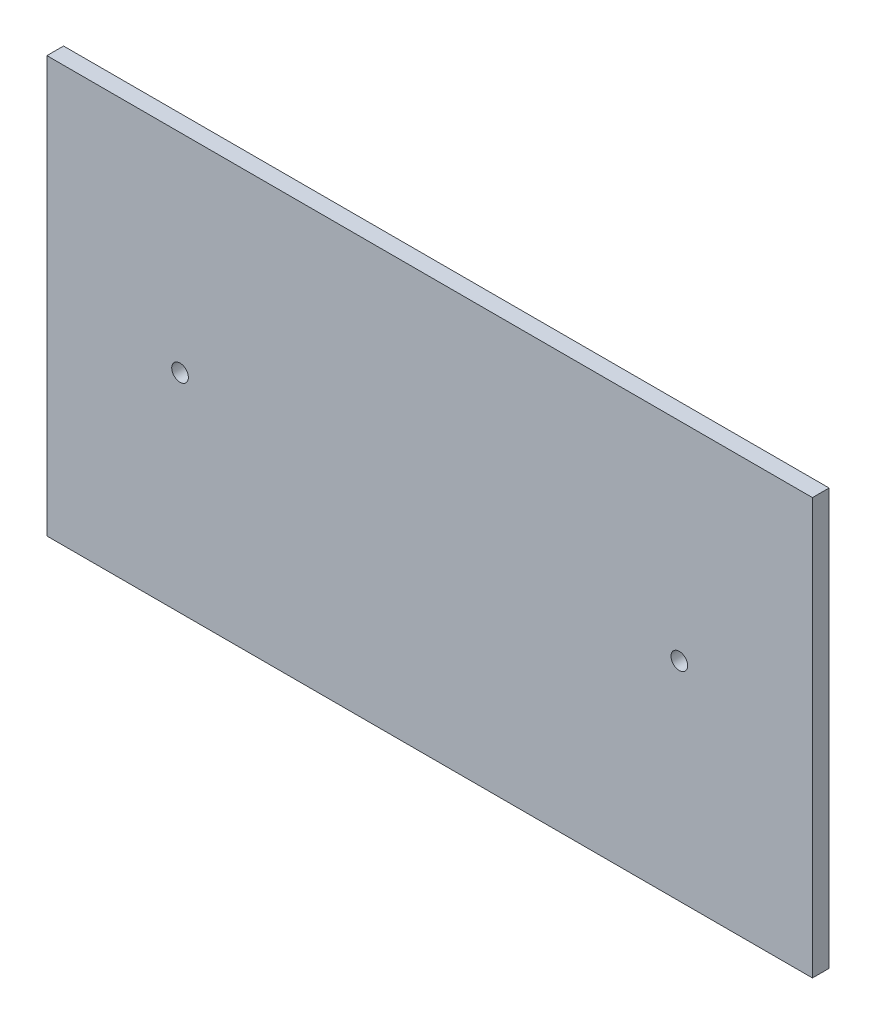
ISO-10303-21;
HEADER;
FILE_DESCRIPTION(('STEP AP214'),'2;1');
FILE_NAME('part.step','',(''),(''),'','','');
FILE_SCHEMA(('AUTOMOTIVE_DESIGN { 1 0 10303 214 1 1 1 1 }'));
ENDSEC;
DATA;
#1=APPLICATION_CONTEXT('core data for automotive mechanical design processes');
#2=APPLICATION_PROTOCOL_DEFINITION('international standard','automotive_design',2000,#1);
#3=PRODUCT_CONTEXT('',#1,'mechanical');
#4=PRODUCT('Part','Part','',(#3));
#5=PRODUCT_RELATED_PRODUCT_CATEGORY('part','',(#4));
#6=PRODUCT_DEFINITION_FORMATION('','',#4);
#7=PRODUCT_DEFINITION_CONTEXT('part definition',#1,'design');
#8=PRODUCT_DEFINITION('design','',#6,#7);
#9=PRODUCT_DEFINITION_SHAPE('','',#8);
#10=(LENGTH_UNIT() NAMED_UNIT(*) SI_UNIT(.MILLI.,.METRE.));
#11=(NAMED_UNIT(*) PLANE_ANGLE_UNIT() SI_UNIT($,.RADIAN.));
#12=(NAMED_UNIT(*) SI_UNIT($,.STERADIAN.) SOLID_ANGLE_UNIT());
#13=UNCERTAINTY_MEASURE_WITH_UNIT(LENGTH_MEASURE(1.E-05),#10,'distance_accuracy_value','');
#14=(GEOMETRIC_REPRESENTATION_CONTEXT(3) GLOBAL_UNCERTAINTY_ASSIGNED_CONTEXT((#13)) GLOBAL_UNIT_ASSIGNED_CONTEXT((#10,
#11,#12)) REPRESENTATION_CONTEXT('',''));
#15=CARTESIAN_POINT('',(0.,0.,0.));
#16=DIRECTION('',(0.,0.,1.));
#17=DIRECTION('',(1.,0.,0.));
#18=AXIS2_PLACEMENT_3D('',#15,#16,#17);
#19=CARTESIAN_POINT('',(0.,0.,10.));
#20=DIRECTION('',(0.,0.,1.));
#21=DIRECTION('',(1.,0.,0.));
#22=AXIS2_PLACEMENT_3D('',#19,#20,#21);
#23=PLANE('',#22);
#24=CARTESIAN_POINT('',(-150.,0.,10.));
#25=DIRECTION('',(0.,0.,1.));
#26=DIRECTION('',(1.,0.,0.));
#27=AXIS2_PLACEMENT_3D('',#24,#25,#26);
#28=CIRCLE('',#27,4.99999999999999);
#29=CARTESIAN_POINT('',(-145.,0.,10.));
#30=VERTEX_POINT('',#29);
#31=EDGE_CURVE('E99',#30,#30,#28,.T.);
#32=ORIENTED_EDGE('',*,*,#31,.F.);
#33=EDGE_LOOP('',(#32));
#34=FACE_BOUND('',#33,.T.);
#35=DIRECTION('',(0.,-1.,0.));
#36=VECTOR('',#35,1.);
#37=CARTESIAN_POINT('',(-230.,125.,10.));
#38=LINE('',#37,#36);
#39=CARTESIAN_POINT('',(-230.,125.,10.));
#40=VERTEX_POINT('',#39);
#41=CARTESIAN_POINT('',(-230.,-125.,10.));
#42=VERTEX_POINT('',#41);
#43=EDGE_CURVE('E84',#40,#42,#38,.T.);
#44=ORIENTED_EDGE('',*,*,#43,.T.);
#45=DIRECTION('',(1.,0.,0.));
#46=VECTOR('',#45,1.);
#47=CARTESIAN_POINT('',(-230.,-125.,10.));
#48=LINE('',#47,#46);
#49=CARTESIAN_POINT('',(230.,-125.,10.));
#50=VERTEX_POINT('',#49);
#51=EDGE_CURVE('E79',#42,#50,#48,.T.);
#52=ORIENTED_EDGE('',*,*,#51,.T.);
#53=DIRECTION('',(0.,1.,0.));
#54=VECTOR('',#53,1.);
#55=CARTESIAN_POINT('',(230.,125.,10.));
#56=LINE('',#55,#54);
#57=CARTESIAN_POINT('',(230.,125.,10.));
#58=VERTEX_POINT('',#57);
#59=EDGE_CURVE('E82',#50,#58,#56,.T.);
#60=ORIENTED_EDGE('',*,*,#59,.T.);
#61=DIRECTION('',(-1.,0.,0.));
#62=VECTOR('',#61,1.);
#63=CARTESIAN_POINT('',(-230.,125.,10.));
#64=LINE('',#63,#62);
#65=EDGE_CURVE('E49',#58,#40,#64,.T.);
#66=ORIENTED_EDGE('',*,*,#65,.T.);
#67=EDGE_LOOP('',(#44,#52,#60,#66));
#68=FACE_BOUND('',#67,.T.);
#69=CARTESIAN_POINT('',(150.,0.,10.));
#70=DIRECTION('',(0.,0.,1.));
#71=DIRECTION('',(1.,0.,0.));
#72=AXIS2_PLACEMENT_3D('',#69,#70,#71);
#73=CIRCLE('',#72,4.99999999999999);
#74=CARTESIAN_POINT('',(155.,0.,10.));
#75=VERTEX_POINT('',#74);
#76=EDGE_CURVE('E114',#75,#75,#73,.T.);
#77=ORIENTED_EDGE('',*,*,#76,.F.);
#78=EDGE_LOOP('',(#77));
#79=FACE_BOUND('',#78,.T.);
#80=ADVANCED_FACE('F32',(#34,#68,#79),#23,.T.);
#81=CARTESIAN_POINT('',(0.,0.,0.));
#82=DIRECTION('',(0.,0.,1.));
#83=DIRECTION('',(1.,0.,0.));
#84=AXIS2_PLACEMENT_3D('',#81,#82,#83);
#85=PLANE('',#84);
#86=DIRECTION('',(0.,-1.,0.));
#87=VECTOR('',#86,1.);
#88=CARTESIAN_POINT('',(-230.,125.,0.));
#89=LINE('',#88,#87);
#90=CARTESIAN_POINT('',(-230.,125.,0.));
#91=VERTEX_POINT('',#90);
#92=CARTESIAN_POINT('',(-230.,-125.,0.));
#93=VERTEX_POINT('',#92);
#94=EDGE_CURVE('E96',#91,#93,#89,.T.);
#95=ORIENTED_EDGE('',*,*,#94,.F.);
#96=DIRECTION('',(-1.,0.,0.));
#97=VECTOR('',#96,1.);
#98=CARTESIAN_POINT('',(-230.,125.,0.));
#99=LINE('',#98,#97);
#100=CARTESIAN_POINT('',(230.,125.,0.));
#101=VERTEX_POINT('',#100);
#102=EDGE_CURVE('E72',#101,#91,#99,.T.);
#103=ORIENTED_EDGE('',*,*,#102,.F.);
#104=DIRECTION('',(0.,1.,0.));
#105=VECTOR('',#104,1.);
#106=CARTESIAN_POINT('',(230.,125.,0.));
#107=LINE('',#106,#105);
#108=CARTESIAN_POINT('',(230.,-125.,0.));
#109=VERTEX_POINT('',#108);
#110=EDGE_CURVE('E66',#109,#101,#107,.T.);
#111=ORIENTED_EDGE('',*,*,#110,.F.);
#112=DIRECTION('',(1.,0.,0.));
#113=VECTOR('',#112,1.);
#114=CARTESIAN_POINT('',(-230.,-125.,0.));
#115=LINE('',#114,#113);
#116=EDGE_CURVE('E88',#93,#109,#115,.T.);
#117=ORIENTED_EDGE('',*,*,#116,.F.);
#118=EDGE_LOOP('',(#95,#103,#111,#117));
#119=FACE_BOUND('',#118,.T.);
#120=CARTESIAN_POINT('',(-150.,0.,0.));
#121=DIRECTION('',(0.,0.,1.));
#122=DIRECTION('',(1.,0.,0.));
#123=AXIS2_PLACEMENT_3D('',#120,#121,#122);
#124=CIRCLE('',#123,4.99999999999999);
#125=CARTESIAN_POINT('',(-145.,0.,0.));
#126=VERTEX_POINT('',#125);
#127=EDGE_CURVE('E111',#126,#126,#124,.T.);
#128=ORIENTED_EDGE('',*,*,#127,.T.);
#129=EDGE_LOOP('',(#128));
#130=FACE_BOUND('',#129,.T.);
#131=CARTESIAN_POINT('',(150.,0.,0.));
#132=DIRECTION('',(0.,0.,1.));
#133=DIRECTION('',(1.,0.,0.));
#134=AXIS2_PLACEMENT_3D('',#131,#132,#133);
#135=CIRCLE('',#134,4.99999999999999);
#136=CARTESIAN_POINT('',(155.,0.,0.));
#137=VERTEX_POINT('',#136);
#138=EDGE_CURVE('E117',#137,#137,#135,.T.);
#139=ORIENTED_EDGE('',*,*,#138,.T.);
#140=EDGE_LOOP('',(#139));
#141=FACE_BOUND('',#140,.T.);
#142=ADVANCED_FACE('F107',(#119,#130,#141),#85,.F.);
#143=CARTESIAN_POINT('',(-230.,125.,10.));
#144=DIRECTION('',(1.,0.,0.));
#145=DIRECTION('',(0.,0.,-1.));
#146=AXIS2_PLACEMENT_3D('',#143,#144,#145);
#147=PLANE('',#146);
#148=ORIENTED_EDGE('',*,*,#94,.T.);
#149=DIRECTION('',(0.,0.,-1.));
#150=VECTOR('',#149,1.);
#151=CARTESIAN_POINT('',(-230.,-125.,10.));
#152=LINE('',#151,#150);
#153=EDGE_CURVE('E11',#42,#93,#152,.T.);
#154=ORIENTED_EDGE('',*,*,#153,.F.);
#155=ORIENTED_EDGE('',*,*,#43,.F.);
#156=DIRECTION('',(0.,0.,-1.));
#157=VECTOR('',#156,1.);
#158=CARTESIAN_POINT('',(-230.,125.,10.));
#159=LINE('',#158,#157);
#160=EDGE_CURVE('E92',#40,#91,#159,.T.);
#161=ORIENTED_EDGE('',*,*,#160,.T.);
#162=EDGE_LOOP('',(#148,#154,#155,#161));
#163=FACE_BOUND('',#162,.T.);
#164=ADVANCED_FACE('F34',(#163),#147,.F.);
#165=CARTESIAN_POINT('',(-230.,-125.,10.));
#166=DIRECTION('',(0.,1.,0.));
#167=DIRECTION('',(0.,0.,1.));
#168=AXIS2_PLACEMENT_3D('',#165,#166,#167);
#169=PLANE('',#168);
#170=ORIENTED_EDGE('',*,*,#116,.T.);
#171=DIRECTION('',(0.,0.,-1.));
#172=VECTOR('',#171,1.);
#173=CARTESIAN_POINT('',(230.,-125.,10.));
#174=LINE('',#173,#172);
#175=EDGE_CURVE('E41',#50,#109,#174,.T.);
#176=ORIENTED_EDGE('',*,*,#175,.F.);
#177=ORIENTED_EDGE('',*,*,#51,.F.);
#178=ORIENTED_EDGE('',*,*,#153,.T.);
#179=EDGE_LOOP('',(#170,#176,#177,#178));
#180=FACE_BOUND('',#179,.T.);
#181=ADVANCED_FACE('F87',(#180),#169,.F.);
#182=CARTESIAN_POINT('',(230.,125.,10.));
#183=DIRECTION('',(-1.,0.,0.));
#184=DIRECTION('',(0.,0.,1.));
#185=AXIS2_PLACEMENT_3D('',#182,#183,#184);
#186=PLANE('',#185);
#187=ORIENTED_EDGE('',*,*,#110,.T.);
#188=DIRECTION('',(0.,0.,-1.));
#189=VECTOR('',#188,1.);
#190=CARTESIAN_POINT('',(230.,125.,10.));
#191=LINE('',#190,#189);
#192=EDGE_CURVE('E89',#58,#101,#191,.T.);
#193=ORIENTED_EDGE('',*,*,#192,.F.);
#194=ORIENTED_EDGE('',*,*,#59,.F.);
#195=ORIENTED_EDGE('',*,*,#175,.T.);
#196=EDGE_LOOP('',(#187,#193,#194,#195));
#197=FACE_BOUND('',#196,.T.);
#198=ADVANCED_FACE('F90',(#197),#186,.F.);
#199=CARTESIAN_POINT('',(-230.,125.,10.));
#200=DIRECTION('',(0.,-1.,0.));
#201=DIRECTION('',(1.,0.,0.));
#202=AXIS2_PLACEMENT_3D('',#199,#200,#201);
#203=PLANE('',#202);
#204=ORIENTED_EDGE('',*,*,#102,.T.);
#205=ORIENTED_EDGE('',*,*,#160,.F.);
#206=ORIENTED_EDGE('',*,*,#65,.F.);
#207=ORIENTED_EDGE('',*,*,#192,.T.);
#208=EDGE_LOOP('',(#204,#205,#206,#207));
#209=FACE_BOUND('',#208,.T.);
#210=ADVANCED_FACE('F104',(#209),#203,.F.);
#211=CARTESIAN_POINT('',(-150.,0.,10.));
#212=DIRECTION('',(0.,0.,-1.));
#213=DIRECTION('',(-1.,0.,0.));
#214=AXIS2_PLACEMENT_3D('',#211,#212,#213);
#215=CYLINDRICAL_SURFACE('',#214,4.99999999999999);
#216=ORIENTED_EDGE('',*,*,#31,.T.);
#217=EDGE_LOOP('',(#216));
#218=FACE_BOUND('',#217,.T.);
#219=ORIENTED_EDGE('',*,*,#127,.F.);
#220=EDGE_LOOP('',(#219));
#221=FACE_BOUND('',#220,.T.);
#222=ADVANCED_FACE('F134',(#218,#221),#215,.F.);
#223=CARTESIAN_POINT('',(150.,0.,10.));
#224=DIRECTION('',(0.,0.,-1.));
#225=DIRECTION('',(-1.,0.,0.));
#226=AXIS2_PLACEMENT_3D('',#223,#224,#225);
#227=CYLINDRICAL_SURFACE('',#226,4.99999999999999);
#228=ORIENTED_EDGE('',*,*,#76,.T.);
#229=EDGE_LOOP('',(#228));
#230=FACE_BOUND('',#229,.T.);
#231=ORIENTED_EDGE('',*,*,#138,.F.);
#232=EDGE_LOOP('',(#231));
#233=FACE_BOUND('',#232,.T.);
#234=ADVANCED_FACE('F123',(#230,#233),#227,.F.);
#235=CLOSED_SHELL('',(#80,#142,#164,#181,#198,#210,#222,#234));
#236=MANIFOLD_SOLID_BREP('B2',#235);
#237=ADVANCED_BREP_SHAPE_REPRESENTATION('',(#18,#236),#14);
#238=SHAPE_DEFINITION_REPRESENTATION(#9,#237);
ENDSEC;
END-ISO-10303-21;
